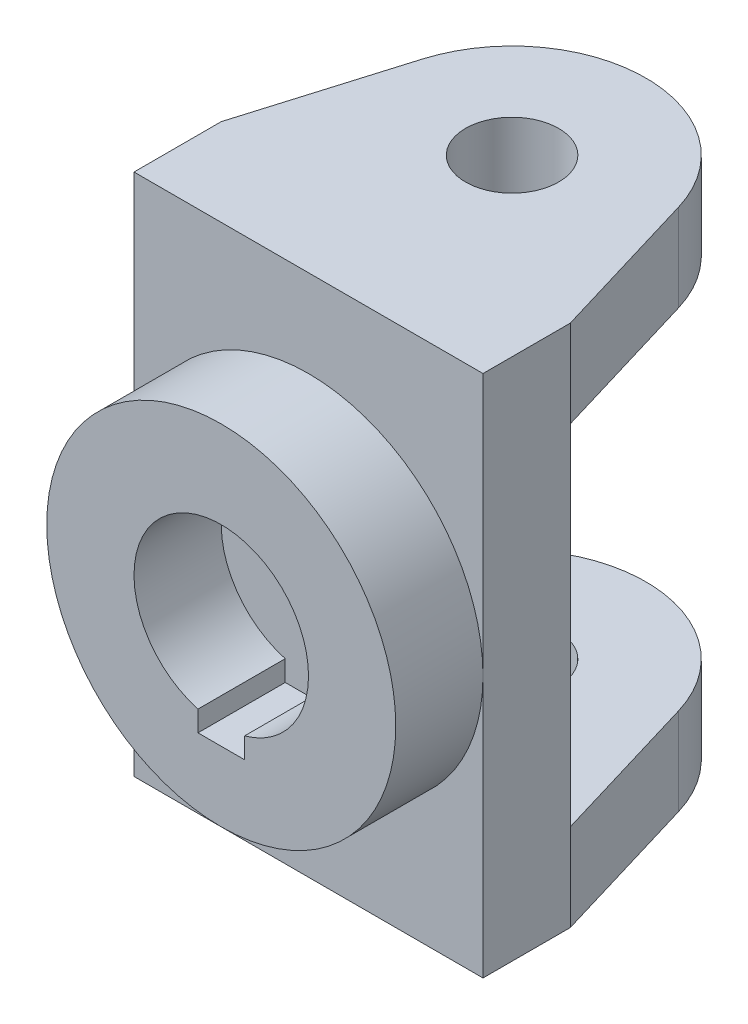
ISO-10303-21;
HEADER;
FILE_DESCRIPTION(('STEP AP214'),'2;1');
FILE_NAME('part.step','',(''),(''),'','','');
FILE_SCHEMA(('AUTOMOTIVE_DESIGN { 1 0 10303 214 1 1 1 1 }'));
ENDSEC;
DATA;
#1=APPLICATION_CONTEXT('core data for automotive mechanical design processes');
#2=APPLICATION_PROTOCOL_DEFINITION('international standard','automotive_design',2000,#1);
#3=PRODUCT_CONTEXT('',#1,'mechanical');
#4=PRODUCT('Part','Part','',(#3));
#5=PRODUCT_RELATED_PRODUCT_CATEGORY('part','',(#4));
#6=PRODUCT_DEFINITION_FORMATION('','',#4);
#7=PRODUCT_DEFINITION_CONTEXT('part definition',#1,'design');
#8=PRODUCT_DEFINITION('design','',#6,#7);
#9=PRODUCT_DEFINITION_SHAPE('','',#8);
#10=(LENGTH_UNIT() NAMED_UNIT(*) SI_UNIT(.MILLI.,.METRE.));
#11=(NAMED_UNIT(*) PLANE_ANGLE_UNIT() SI_UNIT($,.RADIAN.));
#12=(NAMED_UNIT(*) SI_UNIT($,.STERADIAN.) SOLID_ANGLE_UNIT());
#13=UNCERTAINTY_MEASURE_WITH_UNIT(LENGTH_MEASURE(1.E-05),#10,'distance_accuracy_value','');
#14=(GEOMETRIC_REPRESENTATION_CONTEXT(3) GLOBAL_UNCERTAINTY_ASSIGNED_CONTEXT((#13)) GLOBAL_UNIT_ASSIGNED_CONTEXT((#10,
#11,#12)) REPRESENTATION_CONTEXT('',''));
#15=CARTESIAN_POINT('',(0.,0.,0.));
#16=DIRECTION('',(0.,0.,1.));
#17=DIRECTION('',(1.,0.,0.));
#18=AXIS2_PLACEMENT_3D('',#15,#16,#17);
#19=CARTESIAN_POINT('',(0.,0.,0.));
#20=DIRECTION('',(0.,0.,1.));
#21=DIRECTION('',(1.,0.,0.));
#22=AXIS2_PLACEMENT_3D('',#19,#20,#21);
#23=PLANE('',#22);
#24=DIRECTION('',(1.,0.,0.));
#25=VECTOR('',#24,1.);
#26=CARTESIAN_POINT('',(-30.,-30.,0.));
#27=LINE('',#26,#25);
#28=CARTESIAN_POINT('',(-30.,-30.,0.));
#29=VERTEX_POINT('',#28);
#30=CARTESIAN_POINT('',(30.,-30.,0.));
#31=VERTEX_POINT('',#30);
#32=EDGE_CURVE('E157',#29,#31,#27,.T.);
#33=ORIENTED_EDGE('',*,*,#32,.F.);
#34=DIRECTION('',(0.,-1.,0.));
#35=VECTOR('',#34,1.);
#36=CARTESIAN_POINT('',(-30.,-45.,0.));
#37=LINE('',#36,#35);
#38=CARTESIAN_POINT('',(-30.,30.,0.));
#39=VERTEX_POINT('',#38);
#40=EDGE_CURVE('E181',#39,#29,#37,.T.);
#41=ORIENTED_EDGE('',*,*,#40,.F.);
#42=DIRECTION('',(1.,0.,0.));
#43=VECTOR('',#42,1.);
#44=CARTESIAN_POINT('',(-30.,30.,0.));
#45=LINE('',#44,#43);
#46=CARTESIAN_POINT('',(30.,30.,0.));
#47=VERTEX_POINT('',#46);
#48=EDGE_CURVE('E267',#39,#47,#45,.T.);
#49=ORIENTED_EDGE('',*,*,#48,.T.);
#50=DIRECTION('',(0.,1.,0.));
#51=VECTOR('',#50,1.);
#52=CARTESIAN_POINT('',(30.,-45.,0.));
#53=LINE('',#52,#51);
#54=EDGE_CURVE('E57',#31,#47,#53,.T.);
#55=ORIENTED_EDGE('',*,*,#54,.F.);
#56=EDGE_LOOP('',(#33,#41,#49,#55));
#57=FACE_BOUND('',#56,.T.);
#58=ADVANCED_FACE('F39',(#57),#23,.F.);
#59=CARTESIAN_POINT('',(0.,0.,15.));
#60=DIRECTION('',(0.,0.,1.));
#61=DIRECTION('',(1.,0.,0.));
#62=AXIS2_PLACEMENT_3D('',#59,#60,#61);
#63=PLANE('',#62);
#64=CARTESIAN_POINT('',(0.,0.,15.));
#65=DIRECTION('',(0.,0.,1.));
#66=DIRECTION('',(1.,0.,0.));
#67=AXIS2_PLACEMENT_3D('',#64,#65,#66);
#68=CIRCLE('',#67,30.);
#69=CARTESIAN_POINT('',(30.,0.,15.));
#70=VERTEX_POINT('',#69);
#71=CARTESIAN_POINT('',(-30.,0.,15.));
#72=VERTEX_POINT('',#71);
#73=EDGE_CURVE('E50',#70,#72,#68,.T.);
#74=ORIENTED_EDGE('',*,*,#73,.F.);
#75=DIRECTION('',(0.,1.,0.));
#76=VECTOR('',#75,1.);
#77=CARTESIAN_POINT('',(30.,-45.,15.));
#78=LINE('',#77,#76);
#79=CARTESIAN_POINT('',(30.,45.,15.));
#80=VERTEX_POINT('',#79);
#81=EDGE_CURVE('E245',#70,#80,#78,.T.);
#82=ORIENTED_EDGE('',*,*,#81,.T.);
#83=DIRECTION('',(-1.,0.,0.));
#84=VECTOR('',#83,1.);
#85=CARTESIAN_POINT('',(30.,45.,15.));
#86=LINE('',#85,#84);
#87=CARTESIAN_POINT('',(-30.,45.,15.));
#88=VERTEX_POINT('',#87);
#89=EDGE_CURVE('E197',#80,#88,#86,.T.);
#90=ORIENTED_EDGE('',*,*,#89,.T.);
#91=DIRECTION('',(0.,-1.,0.));
#92=VECTOR('',#91,1.);
#93=CARTESIAN_POINT('',(-30.,-45.,15.));
#94=LINE('',#93,#92);
#95=EDGE_CURVE('E224',#88,#72,#94,.T.);
#96=ORIENTED_EDGE('',*,*,#95,.T.);
#97=EDGE_LOOP('',(#74,#82,#90,#96));
#98=FACE_BOUND('',#97,.T.);
#99=ADVANCED_FACE('F231',(#98),#63,.T.);
#100=CARTESIAN_POINT('',(-30.,-45.,15.));
#101=DIRECTION('',(1.,0.,0.));
#102=DIRECTION('',(0.,0.,-1.));
#103=AXIS2_PLACEMENT_3D('',#100,#101,#102);
#104=PLANE('',#103);
#105=CARTESIAN_POINT('',(-30.,45.,0.));
#106=VERTEX_POINT('',#105);
#107=EDGE_CURVE('E187',#106,#39,#37,.T.);
#108=ORIENTED_EDGE('',*,*,#107,.T.);
#109=ORIENTED_EDGE('',*,*,#40,.T.);
#110=DIRECTION('',(0.,-1.,0.));
#111=VECTOR('',#110,1.);
#112=CARTESIAN_POINT('',(-30.,-30.,0.));
#113=LINE('',#112,#111);
#114=CARTESIAN_POINT('',(-30.,-45.,0.));
#115=VERTEX_POINT('',#114);
#116=EDGE_CURVE('E166',#29,#115,#113,.T.);
#117=ORIENTED_EDGE('',*,*,#116,.T.);
#118=DIRECTION('',(0.,0.,-1.));
#119=VECTOR('',#118,1.);
#120=CARTESIAN_POINT('',(-30.,-45.,15.));
#121=LINE('',#120,#119);
#122=CARTESIAN_POINT('',(-30.,-45.,15.));
#123=VERTEX_POINT('',#122);
#124=EDGE_CURVE('E43',#123,#115,#121,.T.);
#125=ORIENTED_EDGE('',*,*,#124,.F.);
#126=EDGE_CURVE('E202',#72,#123,#94,.T.);
#127=ORIENTED_EDGE('',*,*,#126,.F.);
#128=ORIENTED_EDGE('',*,*,#95,.F.);
#129=DIRECTION('',(0.,0.,-1.));
#130=VECTOR('',#129,1.);
#131=CARTESIAN_POINT('',(-30.,45.,15.));
#132=LINE('',#131,#130);
#133=EDGE_CURVE('E203',#88,#106,#132,.T.);
#134=ORIENTED_EDGE('',*,*,#133,.T.);
#135=EDGE_LOOP('',(#108,#109,#117,#125,#127,#128,#134));
#136=FACE_BOUND('',#135,.T.);
#137=ADVANCED_FACE('F41',(#136),#104,.F.);
#138=CARTESIAN_POINT('',(30.,-45.,15.));
#139=DIRECTION('',(0.,1.,0.));
#140=DIRECTION('',(-1.,0.,0.));
#141=AXIS2_PLACEMENT_3D('',#138,#139,#140);
#142=PLANE('',#141);
#143=ORIENTED_EDGE('',*,*,#124,.T.);
#144=DIRECTION('',(-0.286928155857607,0.,0.957952103905072));
#145=VECTOR('',#144,1.);
#146=CARTESIAN_POINT('',(-30.,-45.,0.));
#147=LINE('',#146,#145);
#148=CARTESIAN_POINT('',(-22.0328983898167,-45.,-26.599347584725));
#149=VERTEX_POINT('',#148);
#150=EDGE_CURVE('E169',#149,#115,#147,.T.);
#151=ORIENTED_EDGE('',*,*,#150,.F.);
#152=CARTESIAN_POINT('',(0.,-45.,-20.));
#153=DIRECTION('',(0.,1.,0.));
#154=DIRECTION('',(-1.,0.,0.));
#155=AXIS2_PLACEMENT_3D('',#152,#153,#154);
#156=CIRCLE('',#155,23.);
#157=CARTESIAN_POINT('',(22.0328983898166,-45.,-26.599347584725));
#158=VERTEX_POINT('',#157);
#159=EDGE_CURVE('E561',#158,#149,#156,.T.);
#160=ORIENTED_EDGE('',*,*,#159,.F.);
#161=DIRECTION('',(-0.286928155857607,0.,-0.957952103905071));
#162=VECTOR('',#161,1.);
#163=CARTESIAN_POINT('',(30.,-45.,0.));
#164=LINE('',#163,#162);
#165=CARTESIAN_POINT('',(30.,-45.,0.));
#166=VERTEX_POINT('',#165);
#167=EDGE_CURVE('E184',#166,#158,#164,.T.);
#168=ORIENTED_EDGE('',*,*,#167,.F.);
#169=DIRECTION('',(0.,0.,-1.));
#170=VECTOR('',#169,1.);
#171=CARTESIAN_POINT('',(30.,-45.,15.));
#172=LINE('',#171,#170);
#173=CARTESIAN_POINT('',(30.,-45.,15.));
#174=VERTEX_POINT('',#173);
#175=EDGE_CURVE('E209',#174,#166,#172,.T.);
#176=ORIENTED_EDGE('',*,*,#175,.F.);
#177=DIRECTION('',(1.,0.,0.));
#178=VECTOR('',#177,1.);
#179=CARTESIAN_POINT('',(30.,-45.,15.));
#180=LINE('',#179,#178);
#181=EDGE_CURVE('E220',#123,#174,#180,.T.);
#182=ORIENTED_EDGE('',*,*,#181,.F.);
#183=EDGE_LOOP('',(#143,#151,#160,#168,#176,#182));
#184=FACE_BOUND('',#183,.T.);
#185=CARTESIAN_POINT('',(0.,-45.,-20.));
#186=DIRECTION('',(0.,1.,0.));
#187=DIRECTION('',(-1.,0.,0.));
#188=AXIS2_PLACEMENT_3D('',#185,#186,#187);
#189=CIRCLE('',#188,8.);
#190=CARTESIAN_POINT('',(8.,-45.,-20.));
#191=VERTEX_POINT('',#190);
#192=EDGE_CURVE('E549',#191,#191,#189,.T.);
#193=ORIENTED_EDGE('',*,*,#192,.T.);
#194=EDGE_LOOP('',(#193));
#195=FACE_BOUND('',#194,.T.);
#196=ADVANCED_FACE('F217',(#184,#195),#142,.F.);
#197=CARTESIAN_POINT('',(30.,-45.,15.));
#198=DIRECTION('',(-1.,0.,0.));
#199=DIRECTION('',(0.,0.,1.));
#200=AXIS2_PLACEMENT_3D('',#197,#198,#199);
#201=PLANE('',#200);
#202=EDGE_CURVE('E199',#166,#31,#53,.T.);
#203=ORIENTED_EDGE('',*,*,#202,.T.);
#204=ORIENTED_EDGE('',*,*,#54,.T.);
#205=DIRECTION('',(0.,1.,0.));
#206=VECTOR('',#205,1.);
#207=CARTESIAN_POINT('',(30.,30.,0.));
#208=LINE('',#207,#206);
#209=CARTESIAN_POINT('',(30.,45.,0.));
#210=VERTEX_POINT('',#209);
#211=EDGE_CURVE('E254',#47,#210,#208,.T.);
#212=ORIENTED_EDGE('',*,*,#211,.T.);
#213=DIRECTION('',(0.,0.,-1.));
#214=VECTOR('',#213,1.);
#215=CARTESIAN_POINT('',(30.,45.,15.));
#216=LINE('',#215,#214);
#217=EDGE_CURVE('E206',#80,#210,#216,.T.);
#218=ORIENTED_EDGE('',*,*,#217,.F.);
#219=ORIENTED_EDGE('',*,*,#81,.F.);
#220=EDGE_CURVE('E246',#174,#70,#78,.T.);
#221=ORIENTED_EDGE('',*,*,#220,.F.);
#222=ORIENTED_EDGE('',*,*,#175,.T.);
#223=EDGE_LOOP('',(#203,#204,#212,#218,#219,#221,#222));
#224=FACE_BOUND('',#223,.T.);
#225=ADVANCED_FACE('F252',(#224),#201,.F.);
#226=CARTESIAN_POINT('',(30.,45.,15.));
#227=DIRECTION('',(0.,-1.,0.));
#228=DIRECTION('',(1.,0.,0.));
#229=AXIS2_PLACEMENT_3D('',#226,#227,#228);
#230=PLANE('',#229);
#231=ORIENTED_EDGE('',*,*,#217,.T.);
#232=DIRECTION('',(-0.286928155857607,0.,-0.957952103905071));
#233=VECTOR('',#232,1.);
#234=CARTESIAN_POINT('',(30.,45.,0.));
#235=LINE('',#234,#233);
#236=CARTESIAN_POINT('',(22.0328983898166,45.,-26.599347584725));
#237=VERTEX_POINT('',#236);
#238=EDGE_CURVE('E273',#210,#237,#235,.T.);
#239=ORIENTED_EDGE('',*,*,#238,.T.);
#240=CARTESIAN_POINT('',(0.,45.,-20.));
#241=DIRECTION('',(0.,1.,0.));
#242=DIRECTION('',(-1.,0.,0.));
#243=AXIS2_PLACEMENT_3D('',#240,#241,#242);
#244=CIRCLE('',#243,23.);
#245=CARTESIAN_POINT('',(-22.0328983898167,45.,-26.599347584725));
#246=VERTEX_POINT('',#245);
#247=EDGE_CURVE('E264',#237,#246,#244,.T.);
#248=ORIENTED_EDGE('',*,*,#247,.T.);
#249=DIRECTION('',(-0.286928155857607,0.,0.957952103905072));
#250=VECTOR('',#249,1.);
#251=CARTESIAN_POINT('',(-30.,45.,0.));
#252=LINE('',#251,#250);
#253=EDGE_CURVE('E262',#246,#106,#252,.T.);
#254=ORIENTED_EDGE('',*,*,#253,.T.);
#255=ORIENTED_EDGE('',*,*,#133,.F.);
#256=ORIENTED_EDGE('',*,*,#89,.F.);
#257=EDGE_LOOP('',(#231,#239,#248,#254,#255,#256));
#258=FACE_BOUND('',#257,.T.);
#259=CARTESIAN_POINT('',(0.,45.,-20.));
#260=DIRECTION('',(0.,1.,0.));
#261=DIRECTION('',(-1.,0.,0.));
#262=AXIS2_PLACEMENT_3D('',#259,#260,#261);
#263=CIRCLE('',#262,8.);
#264=CARTESIAN_POINT('',(-8.00000000000001,45.,-20.));
#265=VERTEX_POINT('',#264);
#266=EDGE_CURVE('E570',#265,#265,#263,.T.);
#267=ORIENTED_EDGE('',*,*,#266,.F.);
#268=EDGE_LOOP('',(#267));
#269=FACE_BOUND('',#268,.T.);
#270=ADVANCED_FACE('F257',(#258,#269),#230,.F.);
#271=EDGE_CURVE('E11',#72,#70,#68,.T.);
#272=ORIENTED_EDGE('',*,*,#271,.F.);
#273=ORIENTED_EDGE('',*,*,#126,.T.);
#274=ORIENTED_EDGE('',*,*,#181,.T.);
#275=ORIENTED_EDGE('',*,*,#220,.T.);
#276=EDGE_LOOP('',(#272,#273,#274,#275));
#277=FACE_BOUND('',#276,.T.);
#278=ADVANCED_FACE('F347',(#277),#63,.T.);
#279=CARTESIAN_POINT('',(0.,0.,30.));
#280=DIRECTION('',(0.,0.,1.));
#281=DIRECTION('',(1.,0.,0.));
#282=AXIS2_PLACEMENT_3D('',#279,#280,#281);
#283=PLANE('',#282);
#284=CARTESIAN_POINT('',(0.,0.,30.));
#285=DIRECTION('',(0.,0.,1.));
#286=DIRECTION('',(1.,0.,0.));
#287=AXIS2_PLACEMENT_3D('',#284,#285,#286);
#288=CIRCLE('',#287,30.);
#289=CARTESIAN_POINT('',(30.,0.,30.));
#290=VERTEX_POINT('',#289);
#291=EDGE_CURVE('E189',#290,#290,#288,.T.);
#292=ORIENTED_EDGE('',*,*,#291,.T.);
#293=EDGE_LOOP('',(#292));
#294=FACE_BOUND('',#293,.T.);
#295=DIRECTION('',(0.,1.,0.));
#296=VECTOR('',#295,1.);
#297=CARTESIAN_POINT('',(4.,-14.456832294801,30.));
#298=LINE('',#297,#296);
#299=CARTESIAN_POINT('',(4.,-18.,30.));
#300=VERTEX_POINT('',#299);
#301=CARTESIAN_POINT('',(4.,-14.456832294801,30.));
#302=VERTEX_POINT('',#301);
#303=EDGE_CURVE('E290',#300,#302,#298,.T.);
#304=ORIENTED_EDGE('',*,*,#303,.F.);
#305=DIRECTION('',(1.,0.,0.));
#306=VECTOR('',#305,1.);
#307=CARTESIAN_POINT('',(-4.,-18.,30.));
#308=LINE('',#307,#306);
#309=CARTESIAN_POINT('',(-4.,-18.,30.));
#310=VERTEX_POINT('',#309);
#311=EDGE_CURVE('E287',#310,#300,#308,.T.);
#312=ORIENTED_EDGE('',*,*,#311,.F.);
#313=DIRECTION('',(0.,-1.,0.));
#314=VECTOR('',#313,1.);
#315=CARTESIAN_POINT('',(-4.,-14.456832294801,30.));
#316=LINE('',#315,#314);
#317=CARTESIAN_POINT('',(-4.,-14.456832294801,30.));
#318=VERTEX_POINT('',#317);
#319=EDGE_CURVE('E298',#318,#310,#316,.T.);
#320=ORIENTED_EDGE('',*,*,#319,.F.);
#321=CARTESIAN_POINT('',(0.,0.,30.));
#322=DIRECTION('',(0.,0.,1.));
#323=DIRECTION('',(1.,0.,0.));
#324=AXIS2_PLACEMENT_3D('',#321,#322,#323);
#325=CIRCLE('',#324,15.);
#326=EDGE_CURVE('E294',#302,#318,#325,.T.);
#327=ORIENTED_EDGE('',*,*,#326,.F.);
#328=EDGE_LOOP('',(#304,#312,#320,#327));
#329=FACE_BOUND('',#328,.T.);
#330=ADVANCED_FACE('F336',(#294,#329),#283,.T.);
#331=CARTESIAN_POINT('',(0.,0.,30.));
#332=DIRECTION('',(0.,0.,-1.));
#333=DIRECTION('',(-1.,0.,0.));
#334=AXIS2_PLACEMENT_3D('',#331,#332,#333);
#335=CYLINDRICAL_SURFACE('',#334,30.);
#336=ORIENTED_EDGE('',*,*,#291,.F.);
#337=EDGE_LOOP('',(#336));
#338=FACE_BOUND('',#337,.T.);
#339=ORIENTED_EDGE('',*,*,#73,.T.);
#340=ORIENTED_EDGE('',*,*,#271,.T.);
#341=EDGE_LOOP('',(#339,#340));
#342=FACE_BOUND('',#341,.T.);
#343=ADVANCED_FACE('F236',(#338,#342),#335,.T.);
#344=CARTESIAN_POINT('',(-4.,-18.,30.));
#345=DIRECTION('',(0.,1.,0.));
#346=DIRECTION('',(0.,0.,1.));
#347=AXIS2_PLACEMENT_3D('',#344,#345,#346);
#348=PLANE('',#347);
#349=DIRECTION('',(1.,0.,0.));
#350=VECTOR('',#349,1.);
#351=CARTESIAN_POINT('',(-4.,-18.,15.));
#352=LINE('',#351,#350);
#353=CARTESIAN_POINT('',(-4.,-18.,15.));
#354=VERTEX_POINT('',#353);
#355=CARTESIAN_POINT('',(4.,-18.,15.));
#356=VERTEX_POINT('',#355);
#357=EDGE_CURVE('E280',#354,#356,#352,.T.);
#358=ORIENTED_EDGE('',*,*,#357,.F.);
#359=DIRECTION('',(0.,0.,-1.));
#360=VECTOR('',#359,1.);
#361=CARTESIAN_POINT('',(-4.,-18.,30.));
#362=LINE('',#361,#360);
#363=EDGE_CURVE('E65',#310,#354,#362,.T.);
#364=ORIENTED_EDGE('',*,*,#363,.F.);
#365=ORIENTED_EDGE('',*,*,#311,.T.);
#366=DIRECTION('',(0.,0.,-1.));
#367=VECTOR('',#366,1.);
#368=CARTESIAN_POINT('',(4.,-18.,30.));
#369=LINE('',#368,#367);
#370=EDGE_CURVE('E238',#300,#356,#369,.T.);
#371=ORIENTED_EDGE('',*,*,#370,.T.);
#372=EDGE_LOOP('',(#358,#364,#365,#371));
#373=FACE_BOUND('',#372,.T.);
#374=ADVANCED_FACE('F333',(#373),#348,.T.);
#375=CARTESIAN_POINT('',(4.,-14.456832294801,30.));
#376=DIRECTION('',(-1.,0.,0.));
#377=DIRECTION('',(0.,0.,1.));
#378=AXIS2_PLACEMENT_3D('',#375,#376,#377);
#379=PLANE('',#378);
#380=DIRECTION('',(0.,1.,0.));
#381=VECTOR('',#380,1.);
#382=CARTESIAN_POINT('',(4.,-14.456832294801,15.));
#383=LINE('',#382,#381);
#384=CARTESIAN_POINT('',(4.,-14.456832294801,15.));
#385=VERTEX_POINT('',#384);
#386=EDGE_CURVE('E304',#356,#385,#383,.T.);
#387=ORIENTED_EDGE('',*,*,#386,.F.);
#388=ORIENTED_EDGE('',*,*,#370,.F.);
#389=ORIENTED_EDGE('',*,*,#303,.T.);
#390=DIRECTION('',(0.,0.,-1.));
#391=VECTOR('',#390,1.);
#392=CARTESIAN_POINT('',(4.,-14.456832294801,30.));
#393=LINE('',#392,#391);
#394=EDGE_CURVE('E241',#302,#385,#393,.T.);
#395=ORIENTED_EDGE('',*,*,#394,.T.);
#396=EDGE_LOOP('',(#387,#388,#389,#395));
#397=FACE_BOUND('',#396,.T.);
#398=ADVANCED_FACE('F324',(#397),#379,.T.);
#399=CARTESIAN_POINT('',(0.,0.,30.));
#400=DIRECTION('',(0.,0.,-1.));
#401=DIRECTION('',(-1.,0.,0.));
#402=AXIS2_PLACEMENT_3D('',#399,#400,#401);
#403=CYLINDRICAL_SURFACE('',#402,15.);
#404=CARTESIAN_POINT('',(0.,0.,15.));
#405=DIRECTION('',(0.,0.,1.));
#406=DIRECTION('',(1.,0.,0.));
#407=AXIS2_PLACEMENT_3D('',#404,#405,#406);
#408=CIRCLE('',#407,15.);
#409=CARTESIAN_POINT('',(-4.,-14.456832294801,15.));
#410=VERTEX_POINT('',#409);
#411=EDGE_CURVE('E308',#385,#410,#408,.T.);
#412=ORIENTED_EDGE('',*,*,#411,.F.);
#413=ORIENTED_EDGE('',*,*,#394,.F.);
#414=ORIENTED_EDGE('',*,*,#326,.T.);
#415=DIRECTION('',(0.,0.,-1.));
#416=VECTOR('',#415,1.);
#417=CARTESIAN_POINT('',(-4.,-14.456832294801,30.));
#418=LINE('',#417,#416);
#419=EDGE_CURVE('E317',#318,#410,#418,.T.);
#420=ORIENTED_EDGE('',*,*,#419,.T.);
#421=EDGE_LOOP('',(#412,#413,#414,#420));
#422=FACE_BOUND('',#421,.T.);
#423=ADVANCED_FACE('F329',(#422),#403,.F.);
#424=CARTESIAN_POINT('',(-4.,-14.456832294801,30.));
#425=DIRECTION('',(1.,0.,0.));
#426=DIRECTION('',(0.,0.,-1.));
#427=AXIS2_PLACEMENT_3D('',#424,#425,#426);
#428=PLANE('',#427);
#429=DIRECTION('',(0.,-1.,0.));
#430=VECTOR('',#429,1.);
#431=CARTESIAN_POINT('',(-4.,-14.456832294801,15.));
#432=LINE('',#431,#430);
#433=EDGE_CURVE('E291',#410,#354,#432,.T.);
#434=ORIENTED_EDGE('',*,*,#433,.F.);
#435=ORIENTED_EDGE('',*,*,#419,.F.);
#436=ORIENTED_EDGE('',*,*,#319,.T.);
#437=ORIENTED_EDGE('',*,*,#363,.T.);
#438=EDGE_LOOP('',(#434,#435,#436,#437));
#439=FACE_BOUND('',#438,.T.);
#440=ADVANCED_FACE('F338',(#439),#428,.T.);
#441=ORIENTED_EDGE('',*,*,#433,.T.);
#442=ORIENTED_EDGE('',*,*,#357,.T.);
#443=ORIENTED_EDGE('',*,*,#386,.T.);
#444=ORIENTED_EDGE('',*,*,#411,.T.);
#445=EDGE_LOOP('',(#441,#442,#443,#444));
#446=FACE_BOUND('',#445,.T.);
#447=ADVANCED_FACE('F331',(#446),#63,.T.);
#448=CARTESIAN_POINT('',(-30.,30.,0.));
#449=DIRECTION('',(-0.957952103905072,0.,-0.286928155857607));
#450=DIRECTION('',(-0.286928155857607,0.,0.957952103905072));
#451=AXIS2_PLACEMENT_3D('',#448,#449,#450);
#452=PLANE('',#451);
#453=ORIENTED_EDGE('',*,*,#253,.F.);
#454=DIRECTION('',(0.,1.,0.));
#455=VECTOR('',#454,1.);
#456=CARTESIAN_POINT('',(-22.0328983898167,30.,-26.599347584725));
#457=LINE('',#456,#455);
#458=CARTESIAN_POINT('',(-22.0328983898167,30.,-26.599347584725));
#459=VERTEX_POINT('',#458);
#460=EDGE_CURVE('E277',#459,#246,#457,.T.);
#461=ORIENTED_EDGE('',*,*,#460,.F.);
#462=DIRECTION('',(-0.286928155857607,0.,0.957952103905072));
#463=VECTOR('',#462,1.);
#464=CARTESIAN_POINT('',(-30.,30.,0.));
#465=LINE('',#464,#463);
#466=EDGE_CURVE('E286',#459,#39,#465,.T.);
#467=ORIENTED_EDGE('',*,*,#466,.T.);
#468=ORIENTED_EDGE('',*,*,#107,.F.);
#469=EDGE_LOOP('',(#453,#461,#467,#468));
#470=FACE_BOUND('',#469,.T.);
#471=ADVANCED_FACE('F345',(#470),#452,.T.);
#472=CARTESIAN_POINT('',(0.,30.,-20.));
#473=DIRECTION('',(0.,1.,0.));
#474=DIRECTION('',(-1.,0.,0.));
#475=AXIS2_PLACEMENT_3D('',#472,#473,#474);
#476=CYLINDRICAL_SURFACE('',#475,23.);
#477=ORIENTED_EDGE('',*,*,#247,.F.);
#478=DIRECTION('',(0.,1.,0.));
#479=VECTOR('',#478,1.);
#480=CARTESIAN_POINT('',(22.0328983898166,30.,-26.599347584725));
#481=LINE('',#480,#479);
#482=CARTESIAN_POINT('',(22.0328983898166,30.,-26.599347584725));
#483=VERTEX_POINT('',#482);
#484=EDGE_CURVE('E281',#483,#237,#481,.T.);
#485=ORIENTED_EDGE('',*,*,#484,.F.);
#486=CARTESIAN_POINT('',(0.,30.,-20.));
#487=DIRECTION('',(0.,1.,0.));
#488=DIRECTION('',(-1.,0.,0.));
#489=AXIS2_PLACEMENT_3D('',#486,#487,#488);
#490=CIRCLE('',#489,23.);
#491=EDGE_CURVE('E583',#483,#459,#490,.T.);
#492=ORIENTED_EDGE('',*,*,#491,.T.);
#493=ORIENTED_EDGE('',*,*,#460,.T.);
#494=EDGE_LOOP('',(#477,#485,#492,#493));
#495=FACE_BOUND('',#494,.T.);
#496=ADVANCED_FACE('F442',(#495),#476,.T.);
#497=CARTESIAN_POINT('',(30.,30.,0.));
#498=DIRECTION('',(0.957952103905071,0.,-0.286928155857607));
#499=DIRECTION('',(-0.286928155857607,0.,-0.957952103905071));
#500=AXIS2_PLACEMENT_3D('',#497,#498,#499);
#501=PLANE('',#500);
#502=ORIENTED_EDGE('',*,*,#238,.F.);
#503=ORIENTED_EDGE('',*,*,#211,.F.);
#504=DIRECTION('',(-0.286928155857607,0.,-0.957952103905071));
#505=VECTOR('',#504,1.);
#506=CARTESIAN_POINT('',(30.,30.,0.));
#507=LINE('',#506,#505);
#508=EDGE_CURVE('E271',#47,#483,#507,.T.);
#509=ORIENTED_EDGE('',*,*,#508,.T.);
#510=ORIENTED_EDGE('',*,*,#484,.T.);
#511=EDGE_LOOP('',(#502,#503,#509,#510));
#512=FACE_BOUND('',#511,.T.);
#513=ADVANCED_FACE('F451',(#512),#501,.T.);
#514=CARTESIAN_POINT('',(0.,30.,-20.));
#515=DIRECTION('',(0.,1.,0.));
#516=DIRECTION('',(-1.,0.,0.));
#517=AXIS2_PLACEMENT_3D('',#514,#515,#516);
#518=PLANE('',#517);
#519=CARTESIAN_POINT('',(0.,30.,-20.));
#520=DIRECTION('',(0.,1.,0.));
#521=DIRECTION('',(-1.,0.,0.));
#522=AXIS2_PLACEMENT_3D('',#519,#520,#521);
#523=CIRCLE('',#522,8.);
#524=CARTESIAN_POINT('',(-8.00000000000001,30.,-20.));
#525=VERTEX_POINT('',#524);
#526=EDGE_CURVE('E573',#525,#525,#523,.T.);
#527=ORIENTED_EDGE('',*,*,#526,.T.);
#528=EDGE_LOOP('',(#527));
#529=FACE_BOUND('',#528,.T.);
#530=ORIENTED_EDGE('',*,*,#48,.F.);
#531=ORIENTED_EDGE('',*,*,#466,.F.);
#532=ORIENTED_EDGE('',*,*,#491,.F.);
#533=ORIENTED_EDGE('',*,*,#508,.F.);
#534=EDGE_LOOP('',(#530,#531,#532,#533));
#535=FACE_BOUND('',#534,.T.);
#536=ADVANCED_FACE('F461',(#529,#535),#518,.F.);
#537=CARTESIAN_POINT('',(0.,30.,-20.));
#538=DIRECTION('',(0.,1.,0.));
#539=DIRECTION('',(-1.,0.,0.));
#540=AXIS2_PLACEMENT_3D('',#537,#538,#539);
#541=CYLINDRICAL_SURFACE('',#540,8.);
#542=CARTESIAN_POINT('',(-8.00000000000001,30.,-20.));
#543=CARTESIAN_POINT('',(-8.00000000000001,30.15625,-20.));
#544=CARTESIAN_POINT('',(-8.00000000000001,30.3125,-20.));
#545=CARTESIAN_POINT('',(-8.00000000000001,30.625,-20.));
#546=CARTESIAN_POINT('',(-8.00000000000001,30.78125,-20.));
#547=CARTESIAN_POINT('',(-8.00000000000001,31.09375,-20.));
#548=CARTESIAN_POINT('',(-8.00000000000001,31.25,-20.));
#549=CARTESIAN_POINT('',(-8.00000000000001,31.5625,-20.));
#550=CARTESIAN_POINT('',(-8.00000000000001,31.71875,-20.));
#551=CARTESIAN_POINT('',(-8.00000000000001,32.03125,-20.));
#552=CARTESIAN_POINT('',(-8.00000000000001,32.1875,-20.));
#553=CARTESIAN_POINT('',(-8.00000000000001,32.5,-20.));
#554=CARTESIAN_POINT('',(-8.00000000000001,32.65625,-20.));
#555=CARTESIAN_POINT('',(-8.00000000000001,32.96875,-20.));
#556=CARTESIAN_POINT('',(-8.00000000000001,33.125,-20.));
#557=CARTESIAN_POINT('',(-8.00000000000001,33.4375,-20.));
#558=CARTESIAN_POINT('',(-8.00000000000001,33.59375,-20.));
#559=CARTESIAN_POINT('',(-8.00000000000001,33.90625,-20.));
#560=CARTESIAN_POINT('',(-8.00000000000001,34.0625,-20.));
#561=CARTESIAN_POINT('',(-8.00000000000001,34.375,-20.));
#562=CARTESIAN_POINT('',(-8.00000000000001,34.53125,-20.));
#563=CARTESIAN_POINT('',(-8.00000000000001,34.84375,-20.));
#564=CARTESIAN_POINT('',(-8.00000000000001,35.,-20.));
#565=CARTESIAN_POINT('',(-8.00000000000001,35.3125,-20.));
#566=CARTESIAN_POINT('',(-8.00000000000001,35.46875,-20.));
#567=CARTESIAN_POINT('',(-8.00000000000001,35.78125,-20.));
#568=CARTESIAN_POINT('',(-8.00000000000001,35.9375,-20.));
#569=CARTESIAN_POINT('',(-8.00000000000001,36.25,-20.));
#570=CARTESIAN_POINT('',(-8.00000000000001,36.40625,-20.));
#571=CARTESIAN_POINT('',(-8.00000000000001,36.71875,-20.));
#572=CARTESIAN_POINT('',(-8.00000000000001,36.875,-20.));
#573=CARTESIAN_POINT('',(-8.00000000000001,37.1875,-20.));
#574=CARTESIAN_POINT('',(-8.00000000000001,37.34375,-20.));
#575=CARTESIAN_POINT('',(-8.00000000000001,37.65625,-20.));
#576=CARTESIAN_POINT('',(-8.00000000000001,37.8125,-20.));
#577=CARTESIAN_POINT('',(-8.00000000000001,38.125,-20.));
#578=CARTESIAN_POINT('',(-8.00000000000001,38.28125,-20.));
#579=CARTESIAN_POINT('',(-8.00000000000001,38.59375,-20.));
#580=CARTESIAN_POINT('',(-8.00000000000001,38.75,-20.));
#581=CARTESIAN_POINT('',(-8.00000000000001,39.0625,-20.));
#582=CARTESIAN_POINT('',(-8.00000000000001,39.21875,-20.));
#583=CARTESIAN_POINT('',(-8.00000000000001,39.53125,-20.));
#584=CARTESIAN_POINT('',(-8.00000000000001,39.6875,-20.));
#585=CARTESIAN_POINT('',(-8.00000000000001,40.,-20.));
#586=CARTESIAN_POINT('',(-8.00000000000001,40.15625,-20.));
#587=CARTESIAN_POINT('',(-8.00000000000001,40.46875,-20.));
#588=CARTESIAN_POINT('',(-8.00000000000001,40.625,-20.));
#589=CARTESIAN_POINT('',(-8.00000000000001,40.9375,-20.));
#590=CARTESIAN_POINT('',(-8.00000000000001,41.09375,-20.));
#591=CARTESIAN_POINT('',(-8.00000000000001,41.40625,-20.));
#592=CARTESIAN_POINT('',(-8.00000000000001,41.5625,-20.));
#593=CARTESIAN_POINT('',(-8.00000000000001,41.875,-20.));
#594=CARTESIAN_POINT('',(-8.00000000000001,42.03125,-20.));
#595=CARTESIAN_POINT('',(-8.00000000000001,42.34375,-20.));
#596=CARTESIAN_POINT('',(-8.00000000000001,42.5,-20.));
#597=CARTESIAN_POINT('',(-8.00000000000001,42.8125,-20.));
#598=CARTESIAN_POINT('',(-8.00000000000001,42.96875,-20.));
#599=CARTESIAN_POINT('',(-8.00000000000001,43.28125,-20.));
#600=CARTESIAN_POINT('',(-8.00000000000001,43.4375,-20.));
#601=CARTESIAN_POINT('',(-8.00000000000001,43.75,-20.));
#602=CARTESIAN_POINT('',(-8.00000000000001,43.90625,-20.));
#603=CARTESIAN_POINT('',(-8.00000000000001,44.21875,-20.));
#604=CARTESIAN_POINT('',(-8.00000000000001,44.375,-20.));
#605=CARTESIAN_POINT('',(-8.00000000000001,44.6875,-20.));
#606=CARTESIAN_POINT('',(-8.00000000000001,44.84375,-20.));
#607=CARTESIAN_POINT('',(-8.00000000000001,45.,-20.));
#608=B_SPLINE_CURVE_WITH_KNOTS('',3,(#542,#543,#544,#545,#546,#547,#548,#549,#550,#551,#552,
#553,#554,#555,#556,#557,#558,#559,#560,#561,#562,#563,#564,#565,#566,#567,#568,#569,#570,#571,
#572,#573,#574,#575,#576,#577,#578,#579,#580,#581,#582,#583,#584,#585,#586,#587,#588,#589,#590,
#591,#592,#593,#594,#595,#596,#597,#598,#599,#600,#601,#602,#603,#604,#605,#606,#607),
.UNSPECIFIED.,.F.,.F.,(4,2,2,2,2,2,2,2,2,2,2,2,2,2,2,2,2,2,2,2,2,2,2,2,2,2,2,2,2,2,2,2,4),(0.,
0.46875,0.937500000000001,1.40625,1.875,2.34375,2.8125,3.28125,3.75,4.21875,4.6875,5.15625,
5.625,6.09375,6.5625,7.03125,7.5,7.96875,8.4375,8.90625,9.37500000000001,9.84375,10.3125,
10.78125,11.25,11.71875,12.1875,12.65625,13.125,13.59375,14.0625,14.53125,15.),.UNSPECIFIED.);
#609=EDGE_CURVE('BSEAM470',#525,#265,#608,.T.);
#610=ORIENTED_EDGE('',*,*,#526,.F.);
#611=ORIENTED_EDGE('',*,*,#266,.T.);
#612=ORIENTED_EDGE('',*,*,#609,.T.);
#613=ORIENTED_EDGE('',*,*,#609,.F.);
#614=EDGE_LOOP('',(#610,#612,#611,#613));
#615=FACE_BOUND('',#614,.T.);
#616=ADVANCED_FACE('F470',(#615),#541,.F.);
#617=CARTESIAN_POINT('',(0.,-30.,-20.));
#618=DIRECTION('',(0.,-1.,0.));
#619=DIRECTION('',(-1.,0.,0.));
#620=AXIS2_PLACEMENT_3D('',#617,#618,#619);
#621=PLANE('',#620);
#622=ORIENTED_EDGE('',*,*,#32,.T.);
#623=DIRECTION('',(-0.286928155857607,0.,-0.957952103905071));
#624=VECTOR('',#623,1.);
#625=CARTESIAN_POINT('',(30.,-30.,0.));
#626=LINE('',#625,#624);
#627=CARTESIAN_POINT('',(22.0328983898166,-30.,-26.599347584725));
#628=VERTEX_POINT('',#627);
#629=EDGE_CURVE('E176',#31,#628,#626,.T.);
#630=ORIENTED_EDGE('',*,*,#629,.T.);
#631=CARTESIAN_POINT('',(0.,-30.,-20.));
#632=DIRECTION('',(0.,1.,0.));
#633=DIRECTION('',(-1.,0.,0.));
#634=AXIS2_PLACEMENT_3D('',#631,#632,#633);
#635=CIRCLE('',#634,23.);
#636=CARTESIAN_POINT('',(-22.0328983898167,-30.,-26.599347584725));
#637=VERTEX_POINT('',#636);
#638=EDGE_CURVE('E159',#628,#637,#635,.T.);
#639=ORIENTED_EDGE('',*,*,#638,.T.);
#640=DIRECTION('',(-0.286928155857607,0.,0.957952103905072));
#641=VECTOR('',#640,1.);
#642=CARTESIAN_POINT('',(-30.,-30.,0.));
#643=LINE('',#642,#641);
#644=EDGE_CURVE('E152',#637,#29,#643,.T.);
#645=ORIENTED_EDGE('',*,*,#644,.T.);
#646=EDGE_LOOP('',(#622,#630,#639,#645));
#647=FACE_BOUND('',#646,.T.);
#648=CARTESIAN_POINT('',(0.,-30.,-20.));
#649=DIRECTION('',(0.,1.,0.));
#650=DIRECTION('',(-1.,0.,0.));
#651=AXIS2_PLACEMENT_3D('',#648,#649,#650);
#652=CIRCLE('',#651,8.);
#653=CARTESIAN_POINT('',(8.,-30.,-20.));
#654=VERTEX_POINT('',#653);
#655=EDGE_CURVE('E546',#654,#654,#652,.T.);
#656=ORIENTED_EDGE('',*,*,#655,.F.);
#657=EDGE_LOOP('',(#656));
#658=FACE_BOUND('',#657,.T.);
#659=ADVANCED_FACE('F154',(#647,#658),#621,.F.);
#660=CARTESIAN_POINT('',(30.,-30.,0.));
#661=DIRECTION('',(-0.957952103905071,0.,0.286928155857607));
#662=DIRECTION('',(0.286928155857607,0.,0.957952103905071));
#663=AXIS2_PLACEMENT_3D('',#660,#661,#662);
#664=PLANE('',#663);
#665=ORIENTED_EDGE('',*,*,#167,.T.);
#666=DIRECTION('',(0.,-1.,0.));
#667=VECTOR('',#666,1.);
#668=CARTESIAN_POINT('',(22.0328983898166,-30.,-26.599347584725));
#669=LINE('',#668,#667);
#670=EDGE_CURVE('E566',#628,#158,#669,.T.);
#671=ORIENTED_EDGE('',*,*,#670,.F.);
#672=ORIENTED_EDGE('',*,*,#629,.F.);
#673=ORIENTED_EDGE('',*,*,#202,.F.);
#674=EDGE_LOOP('',(#665,#671,#672,#673));
#675=FACE_BOUND('',#674,.T.);
#676=ADVANCED_FACE('F503',(#675),#664,.F.);
#677=CARTESIAN_POINT('',(0.,-30.,-20.));
#678=DIRECTION('',(0.,-1.,0.));
#679=DIRECTION('',(1.,0.,0.));
#680=AXIS2_PLACEMENT_3D('',#677,#678,#679);
#681=CYLINDRICAL_SURFACE('',#680,23.);
#682=ORIENTED_EDGE('',*,*,#159,.T.);
#683=DIRECTION('',(0.,-1.,0.));
#684=VECTOR('',#683,1.);
#685=CARTESIAN_POINT('',(-22.0328983898167,-30.,-26.599347584725));
#686=LINE('',#685,#684);
#687=EDGE_CURVE('E175',#637,#149,#686,.T.);
#688=ORIENTED_EDGE('',*,*,#687,.F.);
#689=ORIENTED_EDGE('',*,*,#638,.F.);
#690=ORIENTED_EDGE('',*,*,#670,.T.);
#691=EDGE_LOOP('',(#682,#688,#689,#690));
#692=FACE_BOUND('',#691,.T.);
#693=ADVANCED_FACE('F511',(#692),#681,.T.);
#694=CARTESIAN_POINT('',(-30.,-30.,0.));
#695=DIRECTION('',(0.957952103905072,0.,0.286928155857607));
#696=DIRECTION('',(0.286928155857607,0.,-0.957952103905072));
#697=AXIS2_PLACEMENT_3D('',#694,#695,#696);
#698=PLANE('',#697);
#699=ORIENTED_EDGE('',*,*,#150,.T.);
#700=ORIENTED_EDGE('',*,*,#116,.F.);
#701=ORIENTED_EDGE('',*,*,#644,.F.);
#702=ORIENTED_EDGE('',*,*,#687,.T.);
#703=EDGE_LOOP('',(#699,#700,#701,#702));
#704=FACE_BOUND('',#703,.T.);
#705=ADVANCED_FACE('F167',(#704),#698,.F.);
#706=CARTESIAN_POINT('',(0.,-30.,-20.));
#707=DIRECTION('',(0.,-1.,0.));
#708=DIRECTION('',(1.,0.,0.));
#709=AXIS2_PLACEMENT_3D('',#706,#707,#708);
#710=CYLINDRICAL_SURFACE('',#709,8.);
#711=CARTESIAN_POINT('',(8.,-30.,-20.));
#712=CARTESIAN_POINT('',(8.,-30.15625,-20.));
#713=CARTESIAN_POINT('',(8.,-30.3125,-20.));
#714=CARTESIAN_POINT('',(8.,-30.625,-20.));
#715=CARTESIAN_POINT('',(8.,-30.78125,-20.));
#716=CARTESIAN_POINT('',(8.,-31.09375,-20.));
#717=CARTESIAN_POINT('',(8.,-31.25,-20.));
#718=CARTESIAN_POINT('',(8.,-31.5625,-20.));
#719=CARTESIAN_POINT('',(8.,-31.71875,-20.));
#720=CARTESIAN_POINT('',(8.,-32.03125,-20.));
#721=CARTESIAN_POINT('',(8.,-32.1875,-20.));
#722=CARTESIAN_POINT('',(8.,-32.5,-20.));
#723=CARTESIAN_POINT('',(8.,-32.65625,-20.));
#724=CARTESIAN_POINT('',(8.,-32.96875,-20.));
#725=CARTESIAN_POINT('',(8.,-33.125,-20.));
#726=CARTESIAN_POINT('',(8.,-33.4375,-20.));
#727=CARTESIAN_POINT('',(8.,-33.59375,-20.));
#728=CARTESIAN_POINT('',(8.,-33.90625,-20.));
#729=CARTESIAN_POINT('',(8.,-34.0625,-20.));
#730=CARTESIAN_POINT('',(8.,-34.375,-20.));
#731=CARTESIAN_POINT('',(8.,-34.53125,-20.));
#732=CARTESIAN_POINT('',(8.,-34.84375,-20.));
#733=CARTESIAN_POINT('',(8.,-35.,-20.));
#734=CARTESIAN_POINT('',(8.,-35.3125,-20.));
#735=CARTESIAN_POINT('',(8.,-35.46875,-20.));
#736=CARTESIAN_POINT('',(8.,-35.78125,-20.));
#737=CARTESIAN_POINT('',(8.,-35.9375,-20.));
#738=CARTESIAN_POINT('',(8.,-36.25,-20.));
#739=CARTESIAN_POINT('',(8.,-36.40625,-20.));
#740=CARTESIAN_POINT('',(8.,-36.71875,-20.));
#741=CARTESIAN_POINT('',(8.,-36.875,-20.));
#742=CARTESIAN_POINT('',(8.,-37.1875,-20.));
#743=CARTESIAN_POINT('',(8.,-37.34375,-20.));
#744=CARTESIAN_POINT('',(8.,-37.65625,-20.));
#745=CARTESIAN_POINT('',(8.,-37.8125,-20.));
#746=CARTESIAN_POINT('',(8.,-38.125,-20.));
#747=CARTESIAN_POINT('',(8.,-38.28125,-20.));
#748=CARTESIAN_POINT('',(8.,-38.59375,-20.));
#749=CARTESIAN_POINT('',(8.,-38.75,-20.));
#750=CARTESIAN_POINT('',(8.,-39.0625,-20.));
#751=CARTESIAN_POINT('',(8.,-39.21875,-20.));
#752=CARTESIAN_POINT('',(8.,-39.53125,-20.));
#753=CARTESIAN_POINT('',(8.,-39.6875,-20.));
#754=CARTESIAN_POINT('',(8.,-40.,-20.));
#755=CARTESIAN_POINT('',(8.,-40.15625,-20.));
#756=CARTESIAN_POINT('',(8.,-40.46875,-20.));
#757=CARTESIAN_POINT('',(8.,-40.625,-20.));
#758=CARTESIAN_POINT('',(8.,-40.9375,-20.));
#759=CARTESIAN_POINT('',(8.,-41.09375,-20.));
#760=CARTESIAN_POINT('',(8.,-41.40625,-20.));
#761=CARTESIAN_POINT('',(8.,-41.5625,-20.));
#762=CARTESIAN_POINT('',(8.,-41.875,-20.));
#763=CARTESIAN_POINT('',(8.,-42.03125,-20.));
#764=CARTESIAN_POINT('',(8.,-42.34375,-20.));
#765=CARTESIAN_POINT('',(8.,-42.5,-20.));
#766=CARTESIAN_POINT('',(8.,-42.8125,-20.));
#767=CARTESIAN_POINT('',(8.,-42.96875,-20.));
#768=CARTESIAN_POINT('',(8.,-43.28125,-20.));
#769=CARTESIAN_POINT('',(8.,-43.4375,-20.));
#770=CARTESIAN_POINT('',(8.,-43.75,-20.));
#771=CARTESIAN_POINT('',(8.,-43.90625,-20.));
#772=CARTESIAN_POINT('',(8.,-44.21875,-20.));
#773=CARTESIAN_POINT('',(8.,-44.375,-20.));
#774=CARTESIAN_POINT('',(8.,-44.6875,-20.));
#775=CARTESIAN_POINT('',(8.,-44.84375,-20.));
#776=CARTESIAN_POINT('',(8.,-45.,-20.));
#777=B_SPLINE_CURVE_WITH_KNOTS('',3,(#711,#712,#713,#714,#715,#716,#717,#718,#719,#720,#721,
#722,#723,#724,#725,#726,#727,#728,#729,#730,#731,#732,#733,#734,#735,#736,#737,#738,#739,#740,
#741,#742,#743,#744,#745,#746,#747,#748,#749,#750,#751,#752,#753,#754,#755,#756,#757,#758,#759,
#760,#761,#762,#763,#764,#765,#766,#767,#768,#769,#770,#771,#772,#773,#774,#775,#776),
.UNSPECIFIED.,.F.,.F.,(4,2,2,2,2,2,2,2,2,2,2,2,2,2,2,2,2,2,2,2,2,2,2,2,2,2,2,2,2,2,2,2,4),(0.,
0.468749999999997,0.937499999999997,1.40625,1.875,2.34375,2.8125,3.28125,3.75,4.21875,4.6875,
5.15625,5.62499999999999,6.09375,6.5625,7.03125,7.5,7.96875,8.4375,8.90624999999999,9.375,
9.84374999999999,10.3125,10.78125,11.25,11.71875,12.1875,12.65625,13.125,13.59375,14.0625,
14.53125,15.),.UNSPECIFIED.);
#778=EDGE_CURVE('BSEAM528',#654,#191,#777,.T.);
#779=ORIENTED_EDGE('',*,*,#655,.T.);
#780=ORIENTED_EDGE('',*,*,#192,.F.);
#781=ORIENTED_EDGE('',*,*,#778,.T.);
#782=ORIENTED_EDGE('',*,*,#778,.F.);
#783=EDGE_LOOP('',(#779,#781,#780,#782));
#784=FACE_BOUND('',#783,.T.);
#785=ADVANCED_FACE('F528',(#784),#710,.F.);
#786=CLOSED_SHELL('',(#58,#99,#137,#196,#225,#270,#278,#330,#343,#374,#398,#423,#440,#447,#471,
#496,#513,#536,#616,#659,#676,#693,#705,#785));
#787=MANIFOLD_SOLID_BREP('B2',#786);
#788=ADVANCED_BREP_SHAPE_REPRESENTATION('',(#18,#787),#14);
#789=SHAPE_DEFINITION_REPRESENTATION(#9,#788);
ENDSEC;
END-ISO-10303-21;
